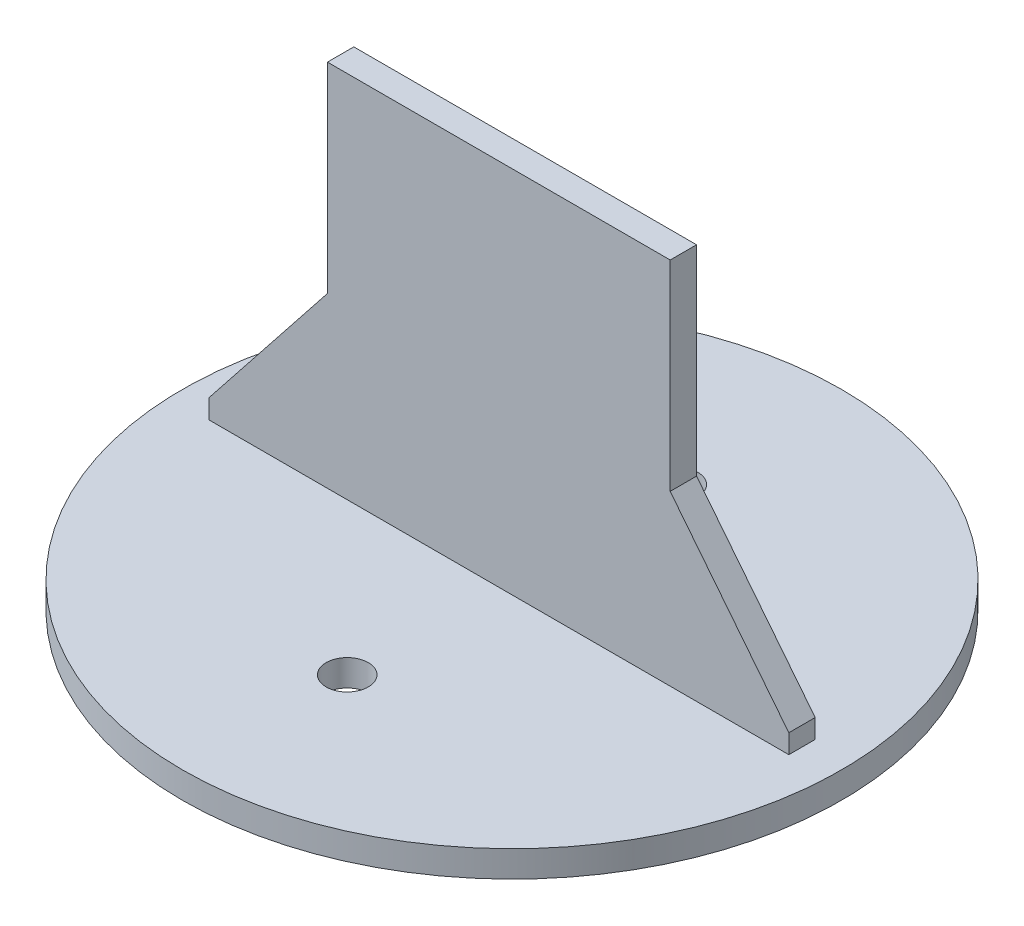
ISO-10303-21;
HEADER;
FILE_DESCRIPTION(('STEP AP214'),'2;1');
FILE_NAME('part.step','',(''),(''),'','','');
FILE_SCHEMA(('AUTOMOTIVE_DESIGN { 1 0 10303 214 1 1 1 1 }'));
ENDSEC;
DATA;
#1=APPLICATION_CONTEXT('core data for automotive mechanical design processes');
#2=APPLICATION_PROTOCOL_DEFINITION('international standard','automotive_design',2000,#1);
#3=PRODUCT_CONTEXT('',#1,'mechanical');
#4=PRODUCT('Part','Part','',(#3));
#5=PRODUCT_RELATED_PRODUCT_CATEGORY('part','',(#4));
#6=PRODUCT_DEFINITION_FORMATION('','',#4);
#7=PRODUCT_DEFINITION_CONTEXT('part definition',#1,'design');
#8=PRODUCT_DEFINITION('design','',#6,#7);
#9=PRODUCT_DEFINITION_SHAPE('','',#8);
#10=(LENGTH_UNIT() NAMED_UNIT(*) SI_UNIT(.MILLI.,.METRE.));
#11=(NAMED_UNIT(*) PLANE_ANGLE_UNIT() SI_UNIT($,.RADIAN.));
#12=(NAMED_UNIT(*) SI_UNIT($,.STERADIAN.) SOLID_ANGLE_UNIT());
#13=UNCERTAINTY_MEASURE_WITH_UNIT(LENGTH_MEASURE(1.E-05),#10,'distance_accuracy_value','');
#14=(GEOMETRIC_REPRESENTATION_CONTEXT(3) GLOBAL_UNCERTAINTY_ASSIGNED_CONTEXT((#13)) GLOBAL_UNIT_ASSIGNED_CONTEXT((#10,
#11,#12)) REPRESENTATION_CONTEXT('',''));
#15=CARTESIAN_POINT('',(0.,0.,0.));
#16=DIRECTION('',(0.,0.,1.));
#17=DIRECTION('',(1.,0.,0.));
#18=AXIS2_PLACEMENT_3D('',#15,#16,#17);
#19=CARTESIAN_POINT('',(0.,0.,0.));
#20=DIRECTION('',(0.,1.,0.));
#21=DIRECTION('',(0.,0.,1.));
#22=AXIS2_PLACEMENT_3D('',#19,#20,#21);
#23=PLANE('',#22);
#24=CARTESIAN_POINT('',(0.,0.,0.));
#25=DIRECTION('',(0.,1.,0.));
#26=DIRECTION('',(0.,0.,1.));
#27=AXIS2_PLACEMENT_3D('',#24,#25,#26);
#28=CIRCLE('',#27,12.5);
#29=CARTESIAN_POINT('',(0.,0.,12.5));
#30=VERTEX_POINT('',#29);
#31=EDGE_CURVE('E36',#30,#30,#28,.T.);
#32=ORIENTED_EDGE('',*,*,#31,.T.);
#33=EDGE_LOOP('',(#32));
#34=FACE_BOUND('',#33,.T.);
#35=CARTESIAN_POINT('',(0.,0.,-6.25));
#36=DIRECTION('',(0.,1.,0.));
#37=DIRECTION('',(0.,0.,1.));
#38=AXIS2_PLACEMENT_3D('',#35,#36,#37);
#39=CIRCLE('',#38,0.8);
#40=CARTESIAN_POINT('',(0.,0.,-5.45));
#41=VERTEX_POINT('',#40);
#42=EDGE_CURVE('E163',#41,#41,#39,.T.);
#43=ORIENTED_EDGE('',*,*,#42,.F.);
#44=EDGE_LOOP('',(#43));
#45=FACE_BOUND('',#44,.T.);
#46=CARTESIAN_POINT('',(0.,0.,6.25));
#47=DIRECTION('',(0.,1.,0.));
#48=DIRECTION('',(0.,0.,1.));
#49=AXIS2_PLACEMENT_3D('',#46,#47,#48);
#50=CIRCLE('',#49,0.8);
#51=CARTESIAN_POINT('',(0.,0.,7.05));
#52=VERTEX_POINT('',#51);
#53=EDGE_CURVE('E159',#52,#52,#50,.T.);
#54=ORIENTED_EDGE('',*,*,#53,.F.);
#55=EDGE_LOOP('',(#54));
#56=FACE_BOUND('',#55,.T.);
#57=DIRECTION('',(0.,0.,-1.));
#58=VECTOR('',#57,1.);
#59=CARTESIAN_POINT('',(11.,0.,0.5));
#60=LINE('',#59,#58);
#61=CARTESIAN_POINT('',(11.,0.,0.5));
#62=VERTEX_POINT('',#61);
#63=CARTESIAN_POINT('',(11.,0.,-0.5));
#64=VERTEX_POINT('',#63);
#65=EDGE_CURVE('E47',#62,#64,#60,.T.);
#66=ORIENTED_EDGE('',*,*,#65,.F.);
#67=DIRECTION('',(1.,0.,0.));
#68=VECTOR('',#67,1.);
#69=CARTESIAN_POINT('',(11.,0.,0.5));
#70=LINE('',#69,#68);
#71=CARTESIAN_POINT('',(-11.,0.,0.5));
#72=VERTEX_POINT('',#71);
#73=EDGE_CURVE('E52',#72,#62,#70,.T.);
#74=ORIENTED_EDGE('',*,*,#73,.F.);
#75=DIRECTION('',(0.,0.,-1.));
#76=VECTOR('',#75,1.);
#77=CARTESIAN_POINT('',(-11.,0.,0.5));
#78=LINE('',#77,#76);
#79=CARTESIAN_POINT('',(-11.,0.,-0.5));
#80=VERTEX_POINT('',#79);
#81=EDGE_CURVE('E127',#72,#80,#78,.T.);
#82=ORIENTED_EDGE('',*,*,#81,.T.);
#83=DIRECTION('',(1.,0.,0.));
#84=VECTOR('',#83,1.);
#85=CARTESIAN_POINT('',(11.,0.,-0.5));
#86=LINE('',#85,#84);
#87=EDGE_CURVE('E128',#80,#64,#86,.T.);
#88=ORIENTED_EDGE('',*,*,#87,.T.);
#89=EDGE_LOOP('',(#66,#74,#82,#88));
#90=FACE_BOUND('',#89,.T.);
#91=ADVANCED_FACE('F32',(#34,#45,#56,#90),#23,.T.);
#92=CARTESIAN_POINT('',(0.,-1.,0.));
#93=DIRECTION('',(0.,1.,0.));
#94=DIRECTION('',(0.,0.,1.));
#95=AXIS2_PLACEMENT_3D('',#92,#93,#94);
#96=CYLINDRICAL_SURFACE('',#95,12.5);
#97=CARTESIAN_POINT('',(0.,-1.,0.));
#98=DIRECTION('',(0.,1.,0.));
#99=DIRECTION('',(0.,0.,1.));
#100=AXIS2_PLACEMENT_3D('',#97,#98,#99);
#101=CIRCLE('',#100,12.5);
#102=CARTESIAN_POINT('',(0.,-1.,12.5));
#103=VERTEX_POINT('',#102);
#104=EDGE_CURVE('E11',#103,#103,#101,.T.);
#105=ORIENTED_EDGE('',*,*,#104,.T.);
#106=EDGE_LOOP('',(#105));
#107=FACE_BOUND('',#106,.T.);
#108=ORIENTED_EDGE('',*,*,#31,.F.);
#109=EDGE_LOOP('',(#108));
#110=FACE_BOUND('',#109,.T.);
#111=ADVANCED_FACE('F34',(#107,#110),#96,.T.);
#112=CARTESIAN_POINT('',(0.,-1.,0.));
#113=DIRECTION('',(0.,1.,0.));
#114=DIRECTION('',(0.,0.,1.));
#115=AXIS2_PLACEMENT_3D('',#112,#113,#114);
#116=PLANE('',#115);
#117=CARTESIAN_POINT('',(0.,-1.,6.25));
#118=DIRECTION('',(0.,1.,0.));
#119=DIRECTION('',(0.,0.,1.));
#120=AXIS2_PLACEMENT_3D('',#117,#118,#119);
#121=CIRCLE('',#120,0.8);
#122=CARTESIAN_POINT('',(0.,-1.,7.05));
#123=VERTEX_POINT('',#122);
#124=EDGE_CURVE('E160',#123,#123,#121,.T.);
#125=ORIENTED_EDGE('',*,*,#124,.T.);
#126=EDGE_LOOP('',(#125));
#127=FACE_BOUND('',#126,.T.);
#128=CARTESIAN_POINT('',(0.,-1.,-6.25));
#129=DIRECTION('',(0.,1.,0.));
#130=DIRECTION('',(0.,0.,1.));
#131=AXIS2_PLACEMENT_3D('',#128,#129,#130);
#132=CIRCLE('',#131,0.8);
#133=CARTESIAN_POINT('',(0.,-1.,-5.45));
#134=VERTEX_POINT('',#133);
#135=EDGE_CURVE('E166',#134,#134,#132,.T.);
#136=ORIENTED_EDGE('',*,*,#135,.T.);
#137=EDGE_LOOP('',(#136));
#138=FACE_BOUND('',#137,.T.);
#139=ORIENTED_EDGE('',*,*,#104,.F.);
#140=EDGE_LOOP('',(#139));
#141=FACE_BOUND('',#140,.T.);
#142=ADVANCED_FACE('F188',(#127,#138,#141),#116,.F.);
#143=CARTESIAN_POINT('',(0.,-1.,-6.25));
#144=DIRECTION('',(0.,1.,0.));
#145=DIRECTION('',(0.,0.,1.));
#146=AXIS2_PLACEMENT_3D('',#143,#144,#145);
#147=CYLINDRICAL_SURFACE('',#146,0.8);
#148=ORIENTED_EDGE('',*,*,#135,.F.);
#149=EDGE_LOOP('',(#148));
#150=FACE_BOUND('',#149,.T.);
#151=ORIENTED_EDGE('',*,*,#42,.T.);
#152=EDGE_LOOP('',(#151));
#153=FACE_BOUND('',#152,.T.);
#154=ADVANCED_FACE('F172',(#150,#153),#147,.F.);
#155=CARTESIAN_POINT('',(0.,-1.,6.25));
#156=DIRECTION('',(0.,1.,0.));
#157=DIRECTION('',(0.,0.,1.));
#158=AXIS2_PLACEMENT_3D('',#155,#156,#157);
#159=CYLINDRICAL_SURFACE('',#158,0.8);
#160=ORIENTED_EDGE('',*,*,#124,.F.);
#161=EDGE_LOOP('',(#160));
#162=FACE_BOUND('',#161,.T.);
#163=ORIENTED_EDGE('',*,*,#53,.T.);
#164=EDGE_LOOP('',(#163));
#165=FACE_BOUND('',#164,.T.);
#166=ADVANCED_FACE('F179',(#162,#165),#159,.F.);
#167=CARTESIAN_POINT('',(11.,0.,0.5));
#168=DIRECTION('',(-1.,0.,0.));
#169=DIRECTION('',(0.,0.,1.));
#170=AXIS2_PLACEMENT_3D('',#167,#168,#169);
#171=PLANE('',#170);
#172=DIRECTION('',(0.,1.,0.));
#173=VECTOR('',#172,1.);
#174=CARTESIAN_POINT('',(11.,0.,-0.5));
#175=LINE('',#174,#173);
#176=CARTESIAN_POINT('',(11.,0.721206205856014,-0.5));
#177=VERTEX_POINT('',#176);
#178=EDGE_CURVE('E106',#64,#177,#175,.T.);
#179=ORIENTED_EDGE('',*,*,#178,.T.);
#180=DIRECTION('',(0.,0.,-1.));
#181=VECTOR('',#180,1.);
#182=CARTESIAN_POINT('',(11.,0.721206205856014,0.5));
#183=LINE('',#182,#181);
#184=CARTESIAN_POINT('',(11.,0.721206205856014,0.5));
#185=VERTEX_POINT('',#184);
#186=EDGE_CURVE('E103',#185,#177,#183,.T.);
#187=ORIENTED_EDGE('',*,*,#186,.F.);
#188=DIRECTION('',(0.,1.,0.));
#189=VECTOR('',#188,1.);
#190=CARTESIAN_POINT('',(11.,0.,0.5));
#191=LINE('',#190,#189);
#192=EDGE_CURVE('E94',#62,#185,#191,.T.);
#193=ORIENTED_EDGE('',*,*,#192,.F.);
#194=ORIENTED_EDGE('',*,*,#65,.T.);
#195=EDGE_LOOP('',(#179,#187,#193,#194));
#196=FACE_BOUND('',#195,.T.);
#197=ADVANCED_FACE('F104',(#196),#171,.F.);
#198=CARTESIAN_POINT('',(11.,0.721206205856014,0.5));
#199=DIRECTION('',(-0.783757714706027,-0.621066699025786,0.));
#200=DIRECTION('',(0.621066699025786,-0.783757714706027,0.));
#201=AXIS2_PLACEMENT_3D('',#198,#199,#200);
#202=PLANE('',#201);
#203=DIRECTION('',(-0.621066699025785,0.783757714706027,0.));
#204=VECTOR('',#203,1.);
#205=CARTESIAN_POINT('',(11.,0.721206205856014,-0.5));
#206=LINE('',#205,#204);
#207=CARTESIAN_POINT('',(6.5,6.4,-0.5));
#208=VERTEX_POINT('',#207);
#209=EDGE_CURVE('E131',#177,#208,#206,.T.);
#210=ORIENTED_EDGE('',*,*,#209,.T.);
#211=DIRECTION('',(0.,0.,-1.));
#212=VECTOR('',#211,1.);
#213=CARTESIAN_POINT('',(6.5,6.4,0.5));
#214=LINE('',#213,#212);
#215=CARTESIAN_POINT('',(6.5,6.4,0.5));
#216=VERTEX_POINT('',#215);
#217=EDGE_CURVE('E109',#216,#208,#214,.T.);
#218=ORIENTED_EDGE('',*,*,#217,.F.);
#219=DIRECTION('',(-0.621066699025785,0.783757714706027,0.));
#220=VECTOR('',#219,1.);
#221=CARTESIAN_POINT('',(11.,0.721206205856014,0.5));
#222=LINE('',#221,#220);
#223=EDGE_CURVE('E98',#185,#216,#222,.T.);
#224=ORIENTED_EDGE('',*,*,#223,.F.);
#225=ORIENTED_EDGE('',*,*,#186,.T.);
#226=EDGE_LOOP('',(#210,#218,#224,#225));
#227=FACE_BOUND('',#226,.T.);
#228=ADVANCED_FACE('F111',(#227),#202,.F.);
#229=CARTESIAN_POINT('',(6.5,6.4,0.5));
#230=DIRECTION('',(-1.,0.,0.));
#231=DIRECTION('',(0.,0.,1.));
#232=AXIS2_PLACEMENT_3D('',#229,#230,#231);
#233=PLANE('',#232);
#234=DIRECTION('',(0.,1.,0.));
#235=VECTOR('',#234,1.);
#236=CARTESIAN_POINT('',(6.5,6.4,-0.5));
#237=LINE('',#236,#235);
#238=CARTESIAN_POINT('',(6.5,14.,-0.5));
#239=VERTEX_POINT('',#238);
#240=EDGE_CURVE('E133',#208,#239,#237,.T.);
#241=ORIENTED_EDGE('',*,*,#240,.T.);
#242=DIRECTION('',(0.,0.,-1.));
#243=VECTOR('',#242,1.);
#244=CARTESIAN_POINT('',(6.5,14.,0.5));
#245=LINE('',#244,#243);
#246=CARTESIAN_POINT('',(6.5,14.,0.5));
#247=VERTEX_POINT('',#246);
#248=EDGE_CURVE('E154',#247,#239,#245,.T.);
#249=ORIENTED_EDGE('',*,*,#248,.F.);
#250=DIRECTION('',(0.,1.,0.));
#251=VECTOR('',#250,1.);
#252=CARTESIAN_POINT('',(6.5,6.4,0.5));
#253=LINE('',#252,#251);
#254=EDGE_CURVE('E114',#216,#247,#253,.T.);
#255=ORIENTED_EDGE('',*,*,#254,.F.);
#256=ORIENTED_EDGE('',*,*,#217,.T.);
#257=EDGE_LOOP('',(#241,#249,#255,#256));
#258=FACE_BOUND('',#257,.T.);
#259=ADVANCED_FACE('F231',(#258),#233,.F.);
#260=CARTESIAN_POINT('',(-6.5,14.,0.5));
#261=DIRECTION('',(0.,-1.,0.));
#262=DIRECTION('',(0.,0.,-1.));
#263=AXIS2_PLACEMENT_3D('',#260,#261,#262);
#264=PLANE('',#263);
#265=DIRECTION('',(-1.,0.,0.));
#266=VECTOR('',#265,1.);
#267=CARTESIAN_POINT('',(-6.5,14.,-0.5));
#268=LINE('',#267,#266);
#269=CARTESIAN_POINT('',(-6.5,14.,-0.5));
#270=VERTEX_POINT('',#269);
#271=EDGE_CURVE('E135',#239,#270,#268,.T.);
#272=ORIENTED_EDGE('',*,*,#271,.T.);
#273=DIRECTION('',(0.,0.,-1.));
#274=VECTOR('',#273,1.);
#275=CARTESIAN_POINT('',(-6.5,14.,0.5));
#276=LINE('',#275,#274);
#277=CARTESIAN_POINT('',(-6.5,14.,0.5));
#278=VERTEX_POINT('',#277);
#279=EDGE_CURVE('E151',#278,#270,#276,.T.);
#280=ORIENTED_EDGE('',*,*,#279,.F.);
#281=DIRECTION('',(-1.,0.,0.));
#282=VECTOR('',#281,1.);
#283=CARTESIAN_POINT('',(-6.5,14.,0.5));
#284=LINE('',#283,#282);
#285=EDGE_CURVE('E116',#247,#278,#284,.T.);
#286=ORIENTED_EDGE('',*,*,#285,.F.);
#287=ORIENTED_EDGE('',*,*,#248,.T.);
#288=EDGE_LOOP('',(#272,#280,#286,#287));
#289=FACE_BOUND('',#288,.T.);
#290=ADVANCED_FACE('F239',(#289),#264,.F.);
#291=CARTESIAN_POINT('',(-6.5,6.4,0.5));
#292=DIRECTION('',(1.,0.,0.));
#293=DIRECTION('',(0.,0.,-1.));
#294=AXIS2_PLACEMENT_3D('',#291,#292,#293);
#295=PLANE('',#294);
#296=DIRECTION('',(0.,-1.,0.));
#297=VECTOR('',#296,1.);
#298=CARTESIAN_POINT('',(-6.5,6.4,-0.5));
#299=LINE('',#298,#297);
#300=CARTESIAN_POINT('',(-6.5,6.4,-0.5));
#301=VERTEX_POINT('',#300);
#302=EDGE_CURVE('E137',#270,#301,#299,.T.);
#303=ORIENTED_EDGE('',*,*,#302,.T.);
#304=DIRECTION('',(0.,0.,-1.));
#305=VECTOR('',#304,1.);
#306=CARTESIAN_POINT('',(-6.5,6.4,0.5));
#307=LINE('',#306,#305);
#308=CARTESIAN_POINT('',(-6.5,6.4,0.5));
#309=VERTEX_POINT('',#308);
#310=EDGE_CURVE('E148',#309,#301,#307,.T.);
#311=ORIENTED_EDGE('',*,*,#310,.F.);
#312=DIRECTION('',(0.,-1.,0.));
#313=VECTOR('',#312,1.);
#314=CARTESIAN_POINT('',(-6.5,6.4,0.5));
#315=LINE('',#314,#313);
#316=EDGE_CURVE('E121',#278,#309,#315,.T.);
#317=ORIENTED_EDGE('',*,*,#316,.F.);
#318=ORIENTED_EDGE('',*,*,#279,.T.);
#319=EDGE_LOOP('',(#303,#311,#317,#318));
#320=FACE_BOUND('',#319,.T.);
#321=ADVANCED_FACE('F249',(#320),#295,.F.);
#322=CARTESIAN_POINT('',(-11.,0.721206205856014,0.5));
#323=DIRECTION('',(0.783757714706027,-0.621066699025786,0.));
#324=DIRECTION('',(0.621066699025786,0.783757714706027,0.));
#325=AXIS2_PLACEMENT_3D('',#322,#323,#324);
#326=PLANE('',#325);
#327=DIRECTION('',(-0.621066699025785,-0.783757714706027,0.));
#328=VECTOR('',#327,1.);
#329=CARTESIAN_POINT('',(-11.,0.721206205856014,-0.5));
#330=LINE('',#329,#328);
#331=CARTESIAN_POINT('',(-11.,0.721206205856014,-0.5));
#332=VERTEX_POINT('',#331);
#333=EDGE_CURVE('E139',#301,#332,#330,.T.);
#334=ORIENTED_EDGE('',*,*,#333,.T.);
#335=DIRECTION('',(0.,0.,-1.));
#336=VECTOR('',#335,1.);
#337=CARTESIAN_POINT('',(-11.,0.721206205856014,0.5));
#338=LINE('',#337,#336);
#339=CARTESIAN_POINT('',(-11.,0.721206205856014,0.5));
#340=VERTEX_POINT('',#339);
#341=EDGE_CURVE('E145',#340,#332,#338,.T.);
#342=ORIENTED_EDGE('',*,*,#341,.F.);
#343=DIRECTION('',(-0.621066699025785,-0.783757714706027,0.));
#344=VECTOR('',#343,1.);
#345=CARTESIAN_POINT('',(-11.,0.721206205856014,0.5));
#346=LINE('',#345,#344);
#347=EDGE_CURVE('E123',#309,#340,#346,.T.);
#348=ORIENTED_EDGE('',*,*,#347,.F.);
#349=ORIENTED_EDGE('',*,*,#310,.T.);
#350=EDGE_LOOP('',(#334,#342,#348,#349));
#351=FACE_BOUND('',#350,.T.);
#352=ADVANCED_FACE('F259',(#351),#326,.F.);
#353=CARTESIAN_POINT('',(-11.,0.,0.5));
#354=DIRECTION('',(1.,0.,0.));
#355=DIRECTION('',(0.,0.,-1.));
#356=AXIS2_PLACEMENT_3D('',#353,#354,#355);
#357=PLANE('',#356);
#358=DIRECTION('',(0.,-1.,0.));
#359=VECTOR('',#358,1.);
#360=CARTESIAN_POINT('',(-11.,0.,-0.5));
#361=LINE('',#360,#359);
#362=EDGE_CURVE('E141',#332,#80,#361,.T.);
#363=ORIENTED_EDGE('',*,*,#362,.T.);
#364=ORIENTED_EDGE('',*,*,#81,.F.);
#365=DIRECTION('',(0.,-1.,0.));
#366=VECTOR('',#365,1.);
#367=CARTESIAN_POINT('',(-11.,0.,0.5));
#368=LINE('',#367,#366);
#369=EDGE_CURVE('E125',#340,#72,#368,.T.);
#370=ORIENTED_EDGE('',*,*,#369,.F.);
#371=ORIENTED_EDGE('',*,*,#341,.T.);
#372=EDGE_LOOP('',(#363,#364,#370,#371));
#373=FACE_BOUND('',#372,.T.);
#374=ADVANCED_FACE('F269',(#373),#357,.F.);
#375=CARTESIAN_POINT('',(0.,0.,0.5));
#376=DIRECTION('',(0.,0.,-1.));
#377=DIRECTION('',(-1.,0.,0.));
#378=AXIS2_PLACEMENT_3D('',#375,#376,#377);
#379=PLANE('',#378);
#380=ORIENTED_EDGE('',*,*,#73,.T.);
#381=ORIENTED_EDGE('',*,*,#192,.T.);
#382=ORIENTED_EDGE('',*,*,#223,.T.);
#383=ORIENTED_EDGE('',*,*,#254,.T.);
#384=ORIENTED_EDGE('',*,*,#285,.T.);
#385=ORIENTED_EDGE('',*,*,#316,.T.);
#386=ORIENTED_EDGE('',*,*,#347,.T.);
#387=ORIENTED_EDGE('',*,*,#369,.T.);
#388=EDGE_LOOP('',(#380,#381,#382,#383,#384,#385,#386,#387));
#389=FACE_BOUND('',#388,.T.);
#390=ADVANCED_FACE('F96',(#389),#379,.F.);
#391=CARTESIAN_POINT('',(0.,0.,-0.5));
#392=DIRECTION('',(0.,0.,-1.));
#393=DIRECTION('',(-1.,0.,0.));
#394=AXIS2_PLACEMENT_3D('',#391,#392,#393);
#395=PLANE('',#394);
#396=ORIENTED_EDGE('',*,*,#87,.F.);
#397=ORIENTED_EDGE('',*,*,#362,.F.);
#398=ORIENTED_EDGE('',*,*,#333,.F.);
#399=ORIENTED_EDGE('',*,*,#302,.F.);
#400=ORIENTED_EDGE('',*,*,#271,.F.);
#401=ORIENTED_EDGE('',*,*,#240,.F.);
#402=ORIENTED_EDGE('',*,*,#209,.F.);
#403=ORIENTED_EDGE('',*,*,#178,.F.);
#404=EDGE_LOOP('',(#396,#397,#398,#399,#400,#401,#402,#403));
#405=FACE_BOUND('',#404,.T.);
#406=ADVANCED_FACE('F288',(#405),#395,.T.);
#407=CLOSED_SHELL('',(#91,#111,#142,#154,#166,#197,#228,#259,#290,#321,#352,#374,#390,#406));
#408=MANIFOLD_SOLID_BREP('B2',#407);
#409=ADVANCED_BREP_SHAPE_REPRESENTATION('',(#18,#408),#14);
#410=SHAPE_DEFINITION_REPRESENTATION(#9,#409);
ENDSEC;
END-ISO-10303-21;
